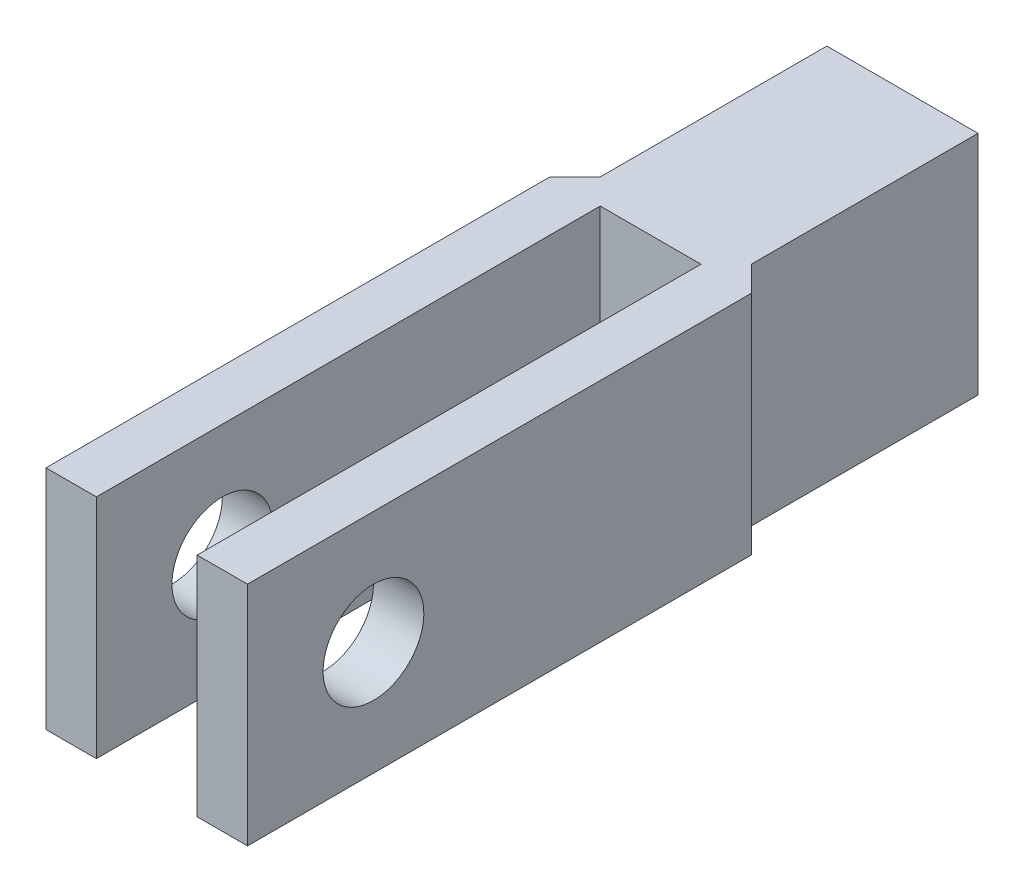
ISO-10303-21;
HEADER;
FILE_DESCRIPTION(('STEP AP214'),'2;1');
FILE_NAME('part.step','',(''),(''),'','','');
FILE_SCHEMA(('AUTOMOTIVE_DESIGN { 1 0 10303 214 1 1 1 1 }'));
ENDSEC;
DATA;
#1=APPLICATION_CONTEXT('core data for automotive mechanical design processes');
#2=APPLICATION_PROTOCOL_DEFINITION('international standard','automotive_design',2000,#1);
#3=PRODUCT_CONTEXT('',#1,'mechanical');
#4=PRODUCT('Part','Part','',(#3));
#5=PRODUCT_RELATED_PRODUCT_CATEGORY('part','',(#4));
#6=PRODUCT_DEFINITION_FORMATION('','',#4);
#7=PRODUCT_DEFINITION_CONTEXT('part definition',#1,'design');
#8=PRODUCT_DEFINITION('design','',#6,#7);
#9=PRODUCT_DEFINITION_SHAPE('','',#8);
#10=(LENGTH_UNIT() NAMED_UNIT(*) SI_UNIT(.MILLI.,.METRE.));
#11=(NAMED_UNIT(*) PLANE_ANGLE_UNIT() SI_UNIT($,.RADIAN.));
#12=(NAMED_UNIT(*) SI_UNIT($,.STERADIAN.) SOLID_ANGLE_UNIT());
#13=UNCERTAINTY_MEASURE_WITH_UNIT(LENGTH_MEASURE(1.E-05),#10,'distance_accuracy_value','');
#14=(GEOMETRIC_REPRESENTATION_CONTEXT(3) GLOBAL_UNCERTAINTY_ASSIGNED_CONTEXT((#13)) GLOBAL_UNIT_ASSIGNED_CONTEXT((#10,
#11,#12)) REPRESENTATION_CONTEXT('',''));
#15=CARTESIAN_POINT('',(0.,0.,0.));
#16=DIRECTION('',(0.,0.,1.));
#17=DIRECTION('',(1.,0.,0.));
#18=AXIS2_PLACEMENT_3D('',#15,#16,#17);
#19=CARTESIAN_POINT('',(0.,0.,10.));
#20=DIRECTION('',(0.,0.,-1.));
#21=DIRECTION('',(-1.,0.,0.));
#22=AXIS2_PLACEMENT_3D('',#19,#20,#21);
#23=PLANE('',#22);
#24=DIRECTION('',(-1.,0.,0.));
#25=VECTOR('',#24,1.);
#26=CARTESIAN_POINT('',(-3.,4.5,10.));
#27=LINE('',#26,#25);
#28=CARTESIAN_POINT('',(2.,4.5,10.));
#29=VERTEX_POINT('',#28);
#30=CARTESIAN_POINT('',(-2.,4.5,10.));
#31=VERTEX_POINT('',#30);
#32=EDGE_CURVE('E217',#29,#31,#27,.T.);
#33=ORIENTED_EDGE('',*,*,#32,.T.);
#34=DIRECTION('',(0.,-1.,0.));
#35=VECTOR('',#34,1.);
#36=CARTESIAN_POINT('',(-2.,4.5,10.));
#37=LINE('',#36,#35);
#38=CARTESIAN_POINT('',(-2.,-4.5,10.));
#39=VERTEX_POINT('',#38);
#40=EDGE_CURVE('E157',#31,#39,#37,.T.);
#41=ORIENTED_EDGE('',*,*,#40,.T.);
#42=DIRECTION('',(1.,0.,0.));
#43=VECTOR('',#42,1.);
#44=CARTESIAN_POINT('',(-3.,-4.5,10.));
#45=LINE('',#44,#43);
#46=CARTESIAN_POINT('',(2.,-4.5,10.));
#47=VERTEX_POINT('',#46);
#48=EDGE_CURVE('E219',#39,#47,#45,.T.);
#49=ORIENTED_EDGE('',*,*,#48,.T.);
#50=DIRECTION('',(0.,-1.,0.));
#51=VECTOR('',#50,1.);
#52=CARTESIAN_POINT('',(2.,4.5,10.));
#53=LINE('',#52,#51);
#54=EDGE_CURVE('E188',#29,#47,#53,.T.);
#55=ORIENTED_EDGE('',*,*,#54,.F.);
#56=EDGE_LOOP('',(#33,#41,#49,#55));
#57=FACE_BOUND('',#56,.T.);
#58=ADVANCED_FACE('F47',(#57),#23,.F.);
#59=CARTESIAN_POINT('',(3.,-4.5,10.));
#60=DIRECTION('',(-1.,0.,0.));
#61=DIRECTION('',(0.,0.,1.));
#62=AXIS2_PLACEMENT_3D('',#59,#60,#61);
#63=PLANE('',#62);
#64=DIRECTION('',(0.,0.,-1.));
#65=VECTOR('',#64,1.);
#66=CARTESIAN_POINT('',(3.,4.5,10.));
#67=LINE('',#66,#65);
#68=CARTESIAN_POINT('',(3.,4.5,9.));
#69=VERTEX_POINT('',#68);
#70=CARTESIAN_POINT('',(3.,4.5,0.));
#71=VERTEX_POINT('',#70);
#72=EDGE_CURVE('E237',#69,#71,#67,.T.);
#73=ORIENTED_EDGE('',*,*,#72,.F.);
#74=DIRECTION('',(0.,-1.,0.));
#75=VECTOR('',#74,1.);
#76=CARTESIAN_POINT('',(3.,-4.5,9.));
#77=LINE('',#76,#75);
#78=CARTESIAN_POINT('',(3.,-4.5,9.));
#79=VERTEX_POINT('',#78);
#80=EDGE_CURVE('E239',#69,#79,#77,.T.);
#81=ORIENTED_EDGE('',*,*,#80,.T.);
#82=DIRECTION('',(0.,0.,-1.));
#83=VECTOR('',#82,1.);
#84=CARTESIAN_POINT('',(3.,-4.5,10.));
#85=LINE('',#84,#83);
#86=CARTESIAN_POINT('',(3.,-4.5,0.));
#87=VERTEX_POINT('',#86);
#88=EDGE_CURVE('E222',#79,#87,#85,.T.);
#89=ORIENTED_EDGE('',*,*,#88,.T.);
#90=DIRECTION('',(0.,1.,0.));
#91=VECTOR('',#90,1.);
#92=CARTESIAN_POINT('',(3.,-4.5,0.));
#93=LINE('',#92,#91);
#94=EDGE_CURVE('E216',#87,#71,#93,.T.);
#95=ORIENTED_EDGE('',*,*,#94,.T.);
#96=EDGE_LOOP('',(#73,#81,#89,#95));
#97=FACE_BOUND('',#96,.T.);
#98=ADVANCED_FACE('F286',(#97),#63,.F.);
#99=CARTESIAN_POINT('',(-3.,4.5,10.));
#100=DIRECTION('',(0.,-1.,0.));
#101=DIRECTION('',(0.,0.,-1.));
#102=AXIS2_PLACEMENT_3D('',#99,#100,#101);
#103=PLANE('',#102);
#104=DIRECTION('',(-1.,0.,0.));
#105=VECTOR('',#104,1.);
#106=CARTESIAN_POINT('',(-3.,4.5,0.));
#107=LINE('',#106,#105);
#108=CARTESIAN_POINT('',(-3.,4.5,0.));
#109=VERTEX_POINT('',#108);
#110=EDGE_CURVE('E225',#71,#109,#107,.T.);
#111=ORIENTED_EDGE('',*,*,#110,.T.);
#112=DIRECTION('',(0.,0.,-1.));
#113=VECTOR('',#112,1.);
#114=CARTESIAN_POINT('',(-3.,4.5,10.));
#115=LINE('',#114,#113);
#116=CARTESIAN_POINT('',(-3.,4.5,9.));
#117=VERTEX_POINT('',#116);
#118=EDGE_CURVE('E235',#117,#109,#115,.T.);
#119=ORIENTED_EDGE('',*,*,#118,.F.);
#120=DIRECTION('',(-0.70710678118655,0.,0.707106781186545));
#121=VECTOR('',#120,1.);
#122=CARTESIAN_POINT('',(-3.5,4.5,9.5));
#123=LINE('',#122,#121);
#124=CARTESIAN_POINT('',(-4.,4.5,10.));
#125=VERTEX_POINT('',#124);
#126=EDGE_CURVE('E13',#117,#125,#123,.T.);
#127=ORIENTED_EDGE('',*,*,#126,.T.);
#128=DIRECTION('',(0.,0.,-1.));
#129=VECTOR('',#128,1.);
#130=CARTESIAN_POINT('',(-4.,4.5,30.));
#131=LINE('',#130,#129);
#132=CARTESIAN_POINT('',(-4.,4.5,30.));
#133=VERTEX_POINT('',#132);
#134=EDGE_CURVE('E168',#133,#125,#131,.T.);
#135=ORIENTED_EDGE('',*,*,#134,.F.);
#136=DIRECTION('',(1.,0.,0.));
#137=VECTOR('',#136,1.);
#138=CARTESIAN_POINT('',(-4.,4.5,30.));
#139=LINE('',#138,#137);
#140=CARTESIAN_POINT('',(-2.,4.5,30.));
#141=VERTEX_POINT('',#140);
#142=EDGE_CURVE('E156',#133,#141,#139,.T.);
#143=ORIENTED_EDGE('',*,*,#142,.T.);
#144=DIRECTION('',(0.,0.,-1.));
#145=VECTOR('',#144,1.);
#146=CARTESIAN_POINT('',(-2.,4.5,30.));
#147=LINE('',#146,#145);
#148=EDGE_CURVE('E174',#141,#31,#147,.T.);
#149=ORIENTED_EDGE('',*,*,#148,.T.);
#150=ORIENTED_EDGE('',*,*,#32,.F.);
#151=DIRECTION('',(0.,0.,-1.));
#152=VECTOR('',#151,1.);
#153=CARTESIAN_POINT('',(2.,4.5,30.));
#154=LINE('',#153,#152);
#155=CARTESIAN_POINT('',(2.,4.5,30.));
#156=VERTEX_POINT('',#155);
#157=EDGE_CURVE('E204',#156,#29,#154,.T.);
#158=ORIENTED_EDGE('',*,*,#157,.F.);
#159=DIRECTION('',(-1.,0.,0.));
#160=VECTOR('',#159,1.);
#161=CARTESIAN_POINT('',(4.,4.5,30.));
#162=LINE('',#161,#160);
#163=CARTESIAN_POINT('',(4.,4.5,30.));
#164=VERTEX_POINT('',#163);
#165=EDGE_CURVE('E187',#164,#156,#162,.T.);
#166=ORIENTED_EDGE('',*,*,#165,.F.);
#167=DIRECTION('',(0.,0.,-1.));
#168=VECTOR('',#167,1.);
#169=CARTESIAN_POINT('',(4.,4.5,30.));
#170=LINE('',#169,#168);
#171=CARTESIAN_POINT('',(4.,4.5,10.));
#172=VERTEX_POINT('',#171);
#173=EDGE_CURVE('E207',#164,#172,#170,.T.);
#174=ORIENTED_EDGE('',*,*,#173,.T.);
#175=DIRECTION('',(-0.70710678118655,0.,-0.707106781186545));
#176=VECTOR('',#175,1.);
#177=CARTESIAN_POINT('',(0.499999999999977,4.5,6.5));
#178=LINE('',#177,#176);
#179=EDGE_CURVE('E241',#172,#69,#178,.T.);
#180=ORIENTED_EDGE('',*,*,#179,.T.);
#181=ORIENTED_EDGE('',*,*,#72,.T.);
#182=EDGE_LOOP('',(#111,#119,#127,#135,#143,#149,#150,#158,#166,#174,#180,#181));
#183=FACE_BOUND('',#182,.T.);
#184=ADVANCED_FACE('F259',(#183),#103,.F.);
#185=CARTESIAN_POINT('',(-3.,-4.5,10.));
#186=DIRECTION('',(1.,0.,0.));
#187=DIRECTION('',(0.,0.,-1.));
#188=AXIS2_PLACEMENT_3D('',#185,#186,#187);
#189=PLANE('',#188);
#190=DIRECTION('',(0.,0.,-1.));
#191=VECTOR('',#190,1.);
#192=CARTESIAN_POINT('',(-3.,-4.5,10.));
#193=LINE('',#192,#191);
#194=CARTESIAN_POINT('',(-3.,-4.5,9.));
#195=VERTEX_POINT('',#194);
#196=CARTESIAN_POINT('',(-3.,-4.5,0.));
#197=VERTEX_POINT('',#196);
#198=EDGE_CURVE('E233',#195,#197,#193,.T.);
#199=ORIENTED_EDGE('',*,*,#198,.F.);
#200=DIRECTION('',(0.,1.,0.));
#201=VECTOR('',#200,1.);
#202=CARTESIAN_POINT('',(-3.,-4.5,9.));
#203=LINE('',#202,#201);
#204=EDGE_CURVE('E62',#195,#117,#203,.T.);
#205=ORIENTED_EDGE('',*,*,#204,.T.);
#206=ORIENTED_EDGE('',*,*,#118,.T.);
#207=DIRECTION('',(0.,-1.,0.));
#208=VECTOR('',#207,1.);
#209=CARTESIAN_POINT('',(-3.,-4.5,0.));
#210=LINE('',#209,#208);
#211=EDGE_CURVE('E228',#109,#197,#210,.T.);
#212=ORIENTED_EDGE('',*,*,#211,.T.);
#213=EDGE_LOOP('',(#199,#205,#206,#212));
#214=FACE_BOUND('',#213,.T.);
#215=ADVANCED_FACE('F303',(#214),#189,.F.);
#216=CARTESIAN_POINT('',(-3.,-4.5,10.));
#217=DIRECTION('',(0.,1.,0.));
#218=DIRECTION('',(0.,0.,1.));
#219=AXIS2_PLACEMENT_3D('',#216,#217,#218);
#220=PLANE('',#219);
#221=DIRECTION('',(1.,0.,0.));
#222=VECTOR('',#221,1.);
#223=CARTESIAN_POINT('',(-3.,-4.5,0.));
#224=LINE('',#223,#222);
#225=EDGE_CURVE('E220',#197,#87,#224,.T.);
#226=ORIENTED_EDGE('',*,*,#225,.T.);
#227=ORIENTED_EDGE('',*,*,#88,.F.);
#228=DIRECTION('',(0.70710678118655,0.,0.707106781186545));
#229=VECTOR('',#228,1.);
#230=CARTESIAN_POINT('',(0.499999999999977,-4.5,6.5));
#231=LINE('',#230,#229);
#232=CARTESIAN_POINT('',(4.,-4.5,10.));
#233=VERTEX_POINT('',#232);
#234=EDGE_CURVE('E243',#79,#233,#231,.T.);
#235=ORIENTED_EDGE('',*,*,#234,.T.);
#236=DIRECTION('',(0.,0.,-1.));
#237=VECTOR('',#236,1.);
#238=CARTESIAN_POINT('',(4.,-4.5,30.));
#239=LINE('',#238,#237);
#240=CARTESIAN_POINT('',(4.,-4.5,30.));
#241=VERTEX_POINT('',#240);
#242=EDGE_CURVE('E194',#241,#233,#239,.T.);
#243=ORIENTED_EDGE('',*,*,#242,.F.);
#244=DIRECTION('',(1.,0.,0.));
#245=VECTOR('',#244,1.);
#246=CARTESIAN_POINT('',(4.,-4.5,30.));
#247=LINE('',#246,#245);
#248=CARTESIAN_POINT('',(2.,-4.5,30.));
#249=VERTEX_POINT('',#248);
#250=EDGE_CURVE('E192',#249,#241,#247,.T.);
#251=ORIENTED_EDGE('',*,*,#250,.F.);
#252=DIRECTION('',(0.,0.,-1.));
#253=VECTOR('',#252,1.);
#254=CARTESIAN_POINT('',(2.,-4.5,30.));
#255=LINE('',#254,#253);
#256=EDGE_CURVE('E201',#249,#47,#255,.T.);
#257=ORIENTED_EDGE('',*,*,#256,.T.);
#258=ORIENTED_EDGE('',*,*,#48,.F.);
#259=DIRECTION('',(0.,0.,-1.));
#260=VECTOR('',#259,1.);
#261=CARTESIAN_POINT('',(-2.,-4.5,30.));
#262=LINE('',#261,#260);
#263=CARTESIAN_POINT('',(-2.,-4.5,30.));
#264=VERTEX_POINT('',#263);
#265=EDGE_CURVE('E147',#264,#39,#262,.T.);
#266=ORIENTED_EDGE('',*,*,#265,.F.);
#267=DIRECTION('',(-1.,0.,0.));
#268=VECTOR('',#267,1.);
#269=CARTESIAN_POINT('',(-4.,-4.5,30.));
#270=LINE('',#269,#268);
#271=CARTESIAN_POINT('',(-4.,-4.5,30.));
#272=VERTEX_POINT('',#271);
#273=EDGE_CURVE('E153',#264,#272,#270,.T.);
#274=ORIENTED_EDGE('',*,*,#273,.T.);
#275=DIRECTION('',(0.,0.,-1.));
#276=VECTOR('',#275,1.);
#277=CARTESIAN_POINT('',(-4.,-4.5,30.));
#278=LINE('',#277,#276);
#279=CARTESIAN_POINT('',(-4.,-4.5,10.));
#280=VERTEX_POINT('',#279);
#281=EDGE_CURVE('E137',#272,#280,#278,.T.);
#282=ORIENTED_EDGE('',*,*,#281,.T.);
#283=DIRECTION('',(0.70710678118655,0.,-0.707106781186545));
#284=VECTOR('',#283,1.);
#285=CARTESIAN_POINT('',(-3.5,-4.5,9.5));
#286=LINE('',#285,#284);
#287=EDGE_CURVE('E55',#280,#195,#286,.T.);
#288=ORIENTED_EDGE('',*,*,#287,.T.);
#289=ORIENTED_EDGE('',*,*,#198,.T.);
#290=EDGE_LOOP('',(#226,#227,#235,#243,#251,#257,#258,#266,#274,#282,#288,#289));
#291=FACE_BOUND('',#290,.T.);
#292=ADVANCED_FACE('F160',(#291),#220,.F.);
#293=CARTESIAN_POINT('',(0.,0.,0.));
#294=DIRECTION('',(0.,0.,-1.));
#295=DIRECTION('',(-1.,0.,0.));
#296=AXIS2_PLACEMENT_3D('',#293,#294,#295);
#297=PLANE('',#296);
#298=CARTESIAN_POINT('',(0.,0.,0.));
#299=DIRECTION('',(0.,0.,-1.));
#300=DIRECTION('',(-1.,0.,0.));
#301=AXIS2_PLACEMENT_3D('',#298,#299,#300);
#302=CIRCLE('',#301,1.64999999999999);
#303=CARTESIAN_POINT('',(-1.64999999999999,0.,0.));
#304=VERTEX_POINT('',#303);
#305=EDGE_CURVE('E210',#304,#304,#302,.T.);
#306=ORIENTED_EDGE('',*,*,#305,.F.);
#307=EDGE_LOOP('',(#306));
#308=FACE_BOUND('',#307,.T.);
#309=ORIENTED_EDGE('',*,*,#94,.F.);
#310=ORIENTED_EDGE('',*,*,#225,.F.);
#311=ORIENTED_EDGE('',*,*,#211,.F.);
#312=ORIENTED_EDGE('',*,*,#110,.F.);
#313=EDGE_LOOP('',(#309,#310,#311,#312));
#314=FACE_BOUND('',#313,.T.);
#315=ADVANCED_FACE('F297',(#308,#314),#297,.T.);
#316=CARTESIAN_POINT('',(0.,0.,8.));
#317=DIRECTION('',(0.,0.,-1.));
#318=DIRECTION('',(-1.,0.,0.));
#319=AXIS2_PLACEMENT_3D('',#316,#317,#318);
#320=CONICAL_SURFACE('',#319,1.65,1.02974425867665);
#321=CARTESIAN_POINT('',(0.,0.,8.99142002139547));
#322=VERTEX_POINT('',#321);
#323=VERTEX_LOOP('',#322);
#324=FACE_BOUND('',#323,.T.);
#325=CARTESIAN_POINT('',(0.,0.,8.));
#326=DIRECTION('',(0.,0.,-1.));
#327=DIRECTION('',(-1.,0.,0.));
#328=AXIS2_PLACEMENT_3D('',#325,#326,#327);
#329=CIRCLE('',#328,1.65);
#330=CARTESIAN_POINT('',(-1.65,0.,8.));
#331=VERTEX_POINT('',#330);
#332=EDGE_CURVE('E213',#331,#331,#329,.T.);
#333=ORIENTED_EDGE('',*,*,#332,.T.);
#334=EDGE_LOOP('',(#333));
#335=FACE_BOUND('',#334,.T.);
#336=ADVANCED_FACE('F295',(#324,#335),#320,.F.);
#337=CARTESIAN_POINT('',(0.,0.,0.));
#338=DIRECTION('',(0.,0.,-1.));
#339=DIRECTION('',(-1.,0.,0.));
#340=AXIS2_PLACEMENT_3D('',#337,#338,#339);
#341=CYLINDRICAL_SURFACE('',#340,1.64999999999999);
#342=ORIENTED_EDGE('',*,*,#332,.F.);
#343=EDGE_LOOP('',(#342));
#344=FACE_BOUND('',#343,.T.);
#345=ORIENTED_EDGE('',*,*,#305,.T.);
#346=EDGE_LOOP('',(#345));
#347=FACE_BOUND('',#346,.T.);
#348=ADVANCED_FACE('F350',(#344,#347),#341,.F.);
#349=CARTESIAN_POINT('',(4.,4.5,30.));
#350=DIRECTION('',(-1.,0.,0.));
#351=DIRECTION('',(0.,-1.,0.));
#352=AXIS2_PLACEMENT_3D('',#349,#350,#351);
#353=PLANE('',#352);
#354=CARTESIAN_POINT('',(4.,0.,25.));
#355=DIRECTION('',(1.,0.,0.));
#356=DIRECTION('',(0.,1.,0.));
#357=AXIS2_PLACEMENT_3D('',#354,#355,#356);
#358=CIRCLE('',#357,2.);
#359=CARTESIAN_POINT('',(4.,2.,25.));
#360=VERTEX_POINT('',#359);
#361=EDGE_CURVE('E146',#360,#360,#358,.T.);
#362=ORIENTED_EDGE('',*,*,#361,.F.);
#363=EDGE_LOOP('',(#362));
#364=FACE_BOUND('',#363,.T.);
#365=DIRECTION('',(0.,1.,0.));
#366=VECTOR('',#365,1.);
#367=CARTESIAN_POINT('',(4.,4.5,10.));
#368=LINE('',#367,#366);
#369=EDGE_CURVE('E183',#233,#172,#368,.T.);
#370=ORIENTED_EDGE('',*,*,#369,.T.);
#371=ORIENTED_EDGE('',*,*,#173,.F.);
#372=DIRECTION('',(0.,1.,0.));
#373=VECTOR('',#372,1.);
#374=CARTESIAN_POINT('',(4.,4.5,30.));
#375=LINE('',#374,#373);
#376=EDGE_CURVE('E184',#241,#164,#375,.T.);
#377=ORIENTED_EDGE('',*,*,#376,.F.);
#378=ORIENTED_EDGE('',*,*,#242,.T.);
#379=EDGE_LOOP('',(#370,#371,#377,#378));
#380=FACE_BOUND('',#379,.T.);
#381=ADVANCED_FACE('F254',(#364,#380),#353,.F.);
#382=CARTESIAN_POINT('',(2.,4.5,30.));
#383=DIRECTION('',(1.,0.,0.));
#384=DIRECTION('',(0.,1.,0.));
#385=AXIS2_PLACEMENT_3D('',#382,#383,#384);
#386=PLANE('',#385);
#387=CARTESIAN_POINT('',(2.,0.,25.));
#388=DIRECTION('',(1.,0.,0.));
#389=DIRECTION('',(0.,1.,0.));
#390=AXIS2_PLACEMENT_3D('',#387,#388,#389);
#391=CIRCLE('',#390,2.);
#392=CARTESIAN_POINT('',(2.,2.,25.));
#393=VERTEX_POINT('',#392);
#394=EDGE_CURVE('E180',#393,#393,#391,.F.);
#395=ORIENTED_EDGE('',*,*,#394,.F.);
#396=EDGE_LOOP('',(#395));
#397=FACE_BOUND('',#396,.T.);
#398=ORIENTED_EDGE('',*,*,#54,.T.);
#399=ORIENTED_EDGE('',*,*,#256,.F.);
#400=DIRECTION('',(0.,-1.,0.));
#401=VECTOR('',#400,1.);
#402=CARTESIAN_POINT('',(2.,4.5,30.));
#403=LINE('',#402,#401);
#404=EDGE_CURVE('E190',#156,#249,#403,.T.);
#405=ORIENTED_EDGE('',*,*,#404,.F.);
#406=ORIENTED_EDGE('',*,*,#157,.T.);
#407=EDGE_LOOP('',(#398,#399,#405,#406));
#408=FACE_BOUND('',#407,.T.);
#409=ADVANCED_FACE('F267',(#397,#408),#386,.F.);
#410=CARTESIAN_POINT('',(0.,0.,30.));
#411=DIRECTION('',(0.,0.,-1.));
#412=DIRECTION('',(-1.,0.,0.));
#413=AXIS2_PLACEMENT_3D('',#410,#411,#412);
#414=PLANE('',#413);
#415=ORIENTED_EDGE('',*,*,#376,.T.);
#416=ORIENTED_EDGE('',*,*,#165,.T.);
#417=ORIENTED_EDGE('',*,*,#404,.T.);
#418=ORIENTED_EDGE('',*,*,#250,.T.);
#419=EDGE_LOOP('',(#415,#416,#417,#418));
#420=FACE_BOUND('',#419,.T.);
#421=ADVANCED_FACE('F264',(#420),#414,.F.);
#422=CARTESIAN_POINT('',(-3.65685424949238,0.,25.));
#423=DIRECTION('',(1.,0.,0.));
#424=DIRECTION('',(0.,1.,0.));
#425=AXIS2_PLACEMENT_3D('',#422,#423,#424);
#426=CYLINDRICAL_SURFACE('',#425,2.);
#427=ORIENTED_EDGE('',*,*,#394,.T.);
#428=EDGE_LOOP('',(#427));
#429=FACE_BOUND('',#428,.T.);
#430=ORIENTED_EDGE('',*,*,#361,.T.);
#431=EDGE_LOOP('',(#430));
#432=FACE_BOUND('',#431,.T.);
#433=ADVANCED_FACE('F281',(#429,#432),#426,.F.);
#434=CARTESIAN_POINT('',(-4.,4.5,30.));
#435=DIRECTION('',(-1.,0.,0.));
#436=DIRECTION('',(0.,-1.,0.));
#437=AXIS2_PLACEMENT_3D('',#434,#435,#436);
#438=PLANE('',#437);
#439=CARTESIAN_POINT('',(-4.,0.,25.));
#440=DIRECTION('',(1.,0.,0.));
#441=DIRECTION('',(0.,1.,0.));
#442=AXIS2_PLACEMENT_3D('',#439,#440,#441);
#443=CIRCLE('',#442,2.);
#444=CARTESIAN_POINT('',(-4.,2.,25.));
#445=VERTEX_POINT('',#444);
#446=EDGE_CURVE('E321',#445,#445,#443,.T.);
#447=ORIENTED_EDGE('',*,*,#446,.T.);
#448=EDGE_LOOP('',(#447));
#449=FACE_BOUND('',#448,.T.);
#450=DIRECTION('',(0.,1.,0.));
#451=VECTOR('',#450,1.);
#452=CARTESIAN_POINT('',(-4.,4.5,10.));
#453=LINE('',#452,#451);
#454=EDGE_CURVE('E144',#280,#125,#453,.T.);
#455=ORIENTED_EDGE('',*,*,#454,.F.);
#456=ORIENTED_EDGE('',*,*,#281,.F.);
#457=DIRECTION('',(0.,1.,0.));
#458=VECTOR('',#457,1.);
#459=CARTESIAN_POINT('',(-4.,4.5,30.));
#460=LINE('',#459,#458);
#461=EDGE_CURVE('E141',#272,#133,#460,.T.);
#462=ORIENTED_EDGE('',*,*,#461,.T.);
#463=ORIENTED_EDGE('',*,*,#134,.T.);
#464=EDGE_LOOP('',(#455,#456,#462,#463));
#465=FACE_BOUND('',#464,.T.);
#466=ADVANCED_FACE('F139',(#449,#465),#438,.T.);
#467=CARTESIAN_POINT('',(-2.,4.5,30.));
#468=DIRECTION('',(1.,0.,0.));
#469=DIRECTION('',(0.,1.,0.));
#470=AXIS2_PLACEMENT_3D('',#467,#468,#469);
#471=PLANE('',#470);
#472=CARTESIAN_POINT('',(-2.,0.,25.));
#473=DIRECTION('',(-1.,0.,0.));
#474=DIRECTION('',(0.,-1.,0.));
#475=AXIS2_PLACEMENT_3D('',#472,#473,#474);
#476=CIRCLE('',#475,2.);
#477=CARTESIAN_POINT('',(-2.,-2.,25.));
#478=VERTEX_POINT('',#477);
#479=EDGE_CURVE('E170',#478,#478,#476,.T.);
#480=ORIENTED_EDGE('',*,*,#479,.T.);
#481=EDGE_LOOP('',(#480));
#482=FACE_BOUND('',#481,.T.);
#483=ORIENTED_EDGE('',*,*,#40,.F.);
#484=ORIENTED_EDGE('',*,*,#148,.F.);
#485=DIRECTION('',(0.,-1.,0.));
#486=VECTOR('',#485,1.);
#487=CARTESIAN_POINT('',(-2.,4.5,30.));
#488=LINE('',#487,#486);
#489=EDGE_CURVE('E162',#141,#264,#488,.T.);
#490=ORIENTED_EDGE('',*,*,#489,.T.);
#491=ORIENTED_EDGE('',*,*,#265,.T.);
#492=EDGE_LOOP('',(#483,#484,#490,#491));
#493=FACE_BOUND('',#492,.T.);
#494=ADVANCED_FACE('F271',(#482,#493),#471,.T.);
#495=CARTESIAN_POINT('',(0.,0.,30.));
#496=DIRECTION('',(0.,0.,-1.));
#497=DIRECTION('',(1.,0.,0.));
#498=AXIS2_PLACEMENT_3D('',#495,#496,#497);
#499=PLANE('',#498);
#500=ORIENTED_EDGE('',*,*,#461,.F.);
#501=ORIENTED_EDGE('',*,*,#273,.F.);
#502=ORIENTED_EDGE('',*,*,#489,.F.);
#503=ORIENTED_EDGE('',*,*,#142,.F.);
#504=EDGE_LOOP('',(#500,#501,#502,#503));
#505=FACE_BOUND('',#504,.T.);
#506=ADVANCED_FACE('F151',(#505),#499,.F.);
#507=CARTESIAN_POINT('',(7.65685424949238,0.,25.));
#508=DIRECTION('',(-1.,0.,0.));
#509=DIRECTION('',(0.,-1.,0.));
#510=AXIS2_PLACEMENT_3D('',#507,#508,#509);
#511=CYLINDRICAL_SURFACE('',#510,2.);
#512=ORIENTED_EDGE('',*,*,#479,.F.);
#513=EDGE_LOOP('',(#512));
#514=FACE_BOUND('',#513,.T.);
#515=ORIENTED_EDGE('',*,*,#446,.F.);
#516=EDGE_LOOP('',(#515));
#517=FACE_BOUND('',#516,.T.);
#518=ADVANCED_FACE('F279',(#514,#517),#511,.F.);
#519=CARTESIAN_POINT('',(4.00000000000001,0.,10.));
#520=DIRECTION('',(-0.707106781186545,0.,0.70710678118655));
#521=DIRECTION('',(0.,1.,0.));
#522=AXIS2_PLACEMENT_3D('',#519,#520,#521);
#523=PLANE('',#522);
#524=ORIENTED_EDGE('',*,*,#234,.F.);
#525=ORIENTED_EDGE('',*,*,#80,.F.);
#526=ORIENTED_EDGE('',*,*,#179,.F.);
#527=ORIENTED_EDGE('',*,*,#369,.F.);
#528=EDGE_LOOP('',(#524,#525,#526,#527));
#529=FACE_BOUND('',#528,.T.);
#530=ADVANCED_FACE('F256',(#529),#523,.F.);
#531=CARTESIAN_POINT('',(-4.,0.,10.));
#532=DIRECTION('',(0.707106781186545,0.,0.70710678118655));
#533=DIRECTION('',(0.,-1.,0.));
#534=AXIS2_PLACEMENT_3D('',#531,#532,#533);
#535=PLANE('',#534);
#536=ORIENTED_EDGE('',*,*,#126,.F.);
#537=ORIENTED_EDGE('',*,*,#204,.F.);
#538=ORIENTED_EDGE('',*,*,#287,.F.);
#539=ORIENTED_EDGE('',*,*,#454,.T.);
#540=EDGE_LOOP('',(#536,#537,#538,#539));
#541=FACE_BOUND('',#540,.T.);
#542=ADVANCED_FACE('F49',(#541),#535,.F.);
#543=CLOSED_SHELL('',(#58,#98,#184,#215,#292,#315,#336,#348,#381,#409,#421,#433,#466,#494,#506,
#518,#530,#542));
#544=MANIFOLD_SOLID_BREP('B2',#543);
#545=ADVANCED_BREP_SHAPE_REPRESENTATION('',(#18,#544),#14);
#546=SHAPE_DEFINITION_REPRESENTATION(#9,#545);
ENDSEC;
END-ISO-10303-21;
